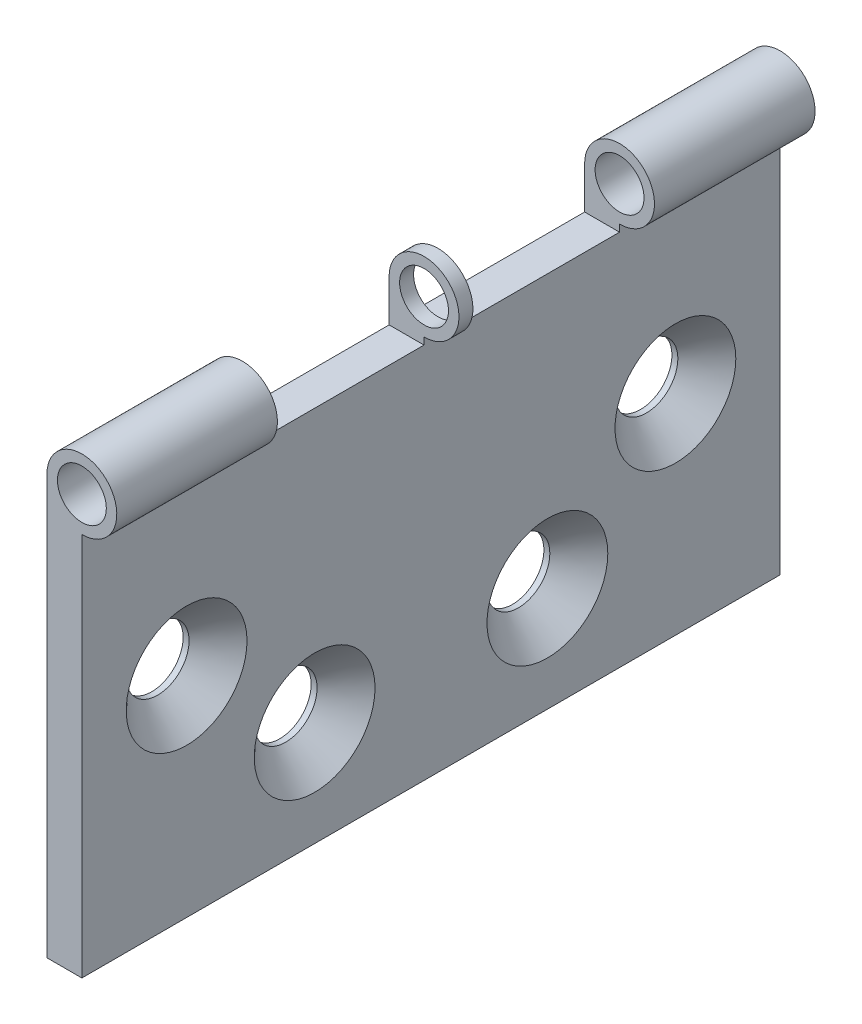
ISO-10303-21;
HEADER;
FILE_DESCRIPTION(('STEP AP214'),'2;1');
FILE_NAME('part.step','',(''),(''),'','','');
FILE_SCHEMA(('AUTOMOTIVE_DESIGN { 1 0 10303 214 1 1 1 1 }'));
ENDSEC;
DATA;
#1=APPLICATION_CONTEXT('core data for automotive mechanical design processes');
#2=APPLICATION_PROTOCOL_DEFINITION('international standard','automotive_design',2000,#1);
#3=PRODUCT_CONTEXT('',#1,'mechanical');
#4=PRODUCT('Part','Part','',(#3));
#5=PRODUCT_RELATED_PRODUCT_CATEGORY('part','',(#4));
#6=PRODUCT_DEFINITION_FORMATION('','',#4);
#7=PRODUCT_DEFINITION_CONTEXT('part definition',#1,'design');
#8=PRODUCT_DEFINITION('design','',#6,#7);
#9=PRODUCT_DEFINITION_SHAPE('','',#8);
#10=(LENGTH_UNIT() NAMED_UNIT(*) SI_UNIT(.MILLI.,.METRE.));
#11=(NAMED_UNIT(*) PLANE_ANGLE_UNIT() SI_UNIT($,.RADIAN.));
#12=(NAMED_UNIT(*) SI_UNIT($,.STERADIAN.) SOLID_ANGLE_UNIT());
#13=UNCERTAINTY_MEASURE_WITH_UNIT(LENGTH_MEASURE(1.E-05),#10,'distance_accuracy_value','');
#14=(GEOMETRIC_REPRESENTATION_CONTEXT(3) GLOBAL_UNCERTAINTY_ASSIGNED_CONTEXT((#13)) GLOBAL_UNIT_ASSIGNED_CONTEXT((#10,
#11,#12)) REPRESENTATION_CONTEXT('',''));
#15=CARTESIAN_POINT('',(0.,0.,0.));
#16=DIRECTION('',(0.,0.,1.));
#17=DIRECTION('',(1.,0.,0.));
#18=AXIS2_PLACEMENT_3D('',#15,#16,#17);
#19=CARTESIAN_POINT('',(5.,0.,50.));
#20=DIRECTION('',(-1.,0.,0.));
#21=DIRECTION('',(0.,0.,1.));
#22=AXIS2_PLACEMENT_3D('',#19,#20,#21);
#23=PLANE('',#22);
#24=CARTESIAN_POINT('',(5.,15.,-16.6666666666667));
#25=DIRECTION('',(1.,0.,0.));
#26=DIRECTION('',(0.,0.,-1.));
#27=AXIS2_PLACEMENT_3D('',#24,#25,#26);
#28=CIRCLE('',#27,8.65);
#29=CARTESIAN_POINT('',(5.,15.,-25.3166666666667));
#30=VERTEX_POINT('',#29);
#31=EDGE_CURVE('E336',#30,#30,#28,.T.);
#32=ORIENTED_EDGE('',*,*,#31,.F.);
#33=EDGE_LOOP('',(#32));
#34=FACE_BOUND('',#33,.T.);
#35=CARTESIAN_POINT('',(5.,30.,35.));
#36=DIRECTION('',(1.,0.,0.));
#37=DIRECTION('',(0.,0.,-1.));
#38=AXIS2_PLACEMENT_3D('',#35,#36,#37);
#39=CIRCLE('',#38,8.65);
#40=CARTESIAN_POINT('',(5.,30.,26.35));
#41=VERTEX_POINT('',#40);
#42=EDGE_CURVE('E348',#41,#41,#39,.T.);
#43=ORIENTED_EDGE('',*,*,#42,.F.);
#44=EDGE_LOOP('',(#43));
#45=FACE_BOUND('',#44,.T.);
#46=CARTESIAN_POINT('',(5.,15.,16.6666666666667));
#47=DIRECTION('',(1.,0.,0.));
#48=DIRECTION('',(0.,0.,-1.));
#49=AXIS2_PLACEMENT_3D('',#46,#47,#48);
#50=CIRCLE('',#49,8.65);
#51=CARTESIAN_POINT('',(5.,15.,8.01666666666667));
#52=VERTEX_POINT('',#51);
#53=EDGE_CURVE('E360',#52,#52,#50,.T.);
#54=ORIENTED_EDGE('',*,*,#53,.F.);
#55=EDGE_LOOP('',(#54));
#56=FACE_BOUND('',#55,.T.);
#57=CARTESIAN_POINT('',(5.,30.,-35.));
#58=DIRECTION('',(1.,0.,0.));
#59=DIRECTION('',(0.,0.,-1.));
#60=AXIS2_PLACEMENT_3D('',#57,#58,#59);
#61=CIRCLE('',#60,8.65);
#62=CARTESIAN_POINT('',(5.,30.,-43.65));
#63=VERTEX_POINT('',#62);
#64=EDGE_CURVE('E324',#63,#63,#61,.T.);
#65=ORIENTED_EDGE('',*,*,#64,.F.);
#66=EDGE_LOOP('',(#65));
#67=FACE_BOUND('',#66,.T.);
#68=DIRECTION('',(0.,1.,0.));
#69=VECTOR('',#68,1.);
#70=CARTESIAN_POINT('',(5.,0.,-27.));
#71=LINE('',#70,#69);
#72=CARTESIAN_POINT('',(5.,54.,-27.));
#73=VERTEX_POINT('',#72);
#74=CARTESIAN_POINT('',(5.,55.,-27.));
#75=VERTEX_POINT('',#74);
#76=EDGE_CURVE('E316',#73,#75,#71,.T.);
#77=ORIENTED_EDGE('',*,*,#76,.F.);
#78=DIRECTION('',(0.,0.,1.));
#79=VECTOR('',#78,1.);
#80=CARTESIAN_POINT('',(5.,54.,50.));
#81=LINE('',#80,#79);
#82=CARTESIAN_POINT('',(5.,54.,-0.999999999999987));
#83=VERTEX_POINT('',#82);
#84=EDGE_CURVE('E259',#73,#83,#81,.T.);
#85=ORIENTED_EDGE('',*,*,#84,.T.);
#86=DIRECTION('',(0.,1.,0.));
#87=VECTOR('',#86,1.);
#88=CARTESIAN_POINT('',(5.,0.,-0.999999999999987));
#89=LINE('',#88,#87);
#90=CARTESIAN_POINT('',(5.,55.,-0.999999999999987));
#91=VERTEX_POINT('',#90);
#92=EDGE_CURVE('E309',#83,#91,#89,.T.);
#93=ORIENTED_EDGE('',*,*,#92,.T.);
#94=DIRECTION('',(0.,0.,-1.));
#95=VECTOR('',#94,1.);
#96=CARTESIAN_POINT('',(5.,55.,50.));
#97=LINE('',#96,#95);
#98=CARTESIAN_POINT('',(5.,55.,0.999999999999987));
#99=VERTEX_POINT('',#98);
#100=EDGE_CURVE('E392',#99,#91,#97,.T.);
#101=ORIENTED_EDGE('',*,*,#100,.F.);
#102=DIRECTION('',(0.,1.,0.));
#103=VECTOR('',#102,1.);
#104=CARTESIAN_POINT('',(5.,0.,0.999999999999987));
#105=LINE('',#104,#103);
#106=CARTESIAN_POINT('',(5.,54.,0.999999999999987));
#107=VERTEX_POINT('',#106);
#108=EDGE_CURVE('E302',#107,#99,#105,.T.);
#109=ORIENTED_EDGE('',*,*,#108,.F.);
#110=DIRECTION('',(0.,0.,1.));
#111=VECTOR('',#110,1.);
#112=CARTESIAN_POINT('',(5.,54.,50.));
#113=LINE('',#112,#111);
#114=CARTESIAN_POINT('',(5.,54.,27.));
#115=VERTEX_POINT('',#114);
#116=EDGE_CURVE('E315',#107,#115,#113,.T.);
#117=ORIENTED_EDGE('',*,*,#116,.T.);
#118=DIRECTION('',(0.,1.,0.));
#119=VECTOR('',#118,1.);
#120=CARTESIAN_POINT('',(5.,0.,27.));
#121=LINE('',#120,#119);
#122=CARTESIAN_POINT('',(5.,55.,27.));
#123=VERTEX_POINT('',#122);
#124=EDGE_CURVE('E294',#115,#123,#121,.T.);
#125=ORIENTED_EDGE('',*,*,#124,.T.);
#126=CARTESIAN_POINT('',(5.,55.,50.));
#127=VERTEX_POINT('',#126);
#128=EDGE_CURVE('E157',#127,#123,#97,.T.);
#129=ORIENTED_EDGE('',*,*,#128,.F.);
#130=DIRECTION('',(0.,1.,0.));
#131=VECTOR('',#130,1.);
#132=CARTESIAN_POINT('',(5.,0.,50.));
#133=LINE('',#132,#131);
#134=CARTESIAN_POINT('',(5.,0.,50.));
#135=VERTEX_POINT('',#134);
#136=EDGE_CURVE('E393',#135,#127,#133,.T.);
#137=ORIENTED_EDGE('',*,*,#136,.F.);
#138=DIRECTION('',(0.,0.,-1.));
#139=VECTOR('',#138,1.);
#140=CARTESIAN_POINT('',(5.,0.,50.));
#141=LINE('',#140,#139);
#142=CARTESIAN_POINT('',(5.,0.,-50.));
#143=VERTEX_POINT('',#142);
#144=EDGE_CURVE('E166',#135,#143,#141,.T.);
#145=ORIENTED_EDGE('',*,*,#144,.T.);
#146=DIRECTION('',(0.,1.,0.));
#147=VECTOR('',#146,1.);
#148=CARTESIAN_POINT('',(5.,0.,-50.));
#149=LINE('',#148,#147);
#150=CARTESIAN_POINT('',(5.,55.,-50.));
#151=VERTEX_POINT('',#150);
#152=EDGE_CURVE('E391',#143,#151,#149,.T.);
#153=ORIENTED_EDGE('',*,*,#152,.T.);
#154=EDGE_CURVE('E388',#75,#151,#97,.T.);
#155=ORIENTED_EDGE('',*,*,#154,.F.);
#156=EDGE_LOOP('',(#77,#85,#93,#101,#109,#117,#125,#129,#137,#145,#153,#155));
#157=FACE_BOUND('',#156,.T.);
#158=ADVANCED_FACE('F139',(#34,#45,#56,#67,#157),#23,.F.);
#159=CARTESIAN_POINT('',(0.,0.,50.));
#160=DIRECTION('',(-1.,0.,0.));
#161=DIRECTION('',(0.,0.,1.));
#162=AXIS2_PLACEMENT_3D('',#159,#160,#161);
#163=PLANE('',#162);
#164=CARTESIAN_POINT('',(0.,30.,-35.));
#165=DIRECTION('',(1.,0.,0.));
#166=DIRECTION('',(0.,0.,-1.));
#167=AXIS2_PLACEMENT_3D('',#164,#165,#166);
#168=CIRCLE('',#167,4.5);
#169=CARTESIAN_POINT('',(0.,30.,-39.5));
#170=VERTEX_POINT('',#169);
#171=EDGE_CURVE('E332',#170,#170,#168,.T.);
#172=ORIENTED_EDGE('',*,*,#171,.T.);
#173=EDGE_LOOP('',(#172));
#174=FACE_BOUND('',#173,.T.);
#175=CARTESIAN_POINT('',(0.,15.,-16.6666666666667));
#176=DIRECTION('',(1.,0.,0.));
#177=DIRECTION('',(0.,0.,-1.));
#178=AXIS2_PLACEMENT_3D('',#175,#176,#177);
#179=CIRCLE('',#178,4.5);
#180=CARTESIAN_POINT('',(0.,15.,-21.1666666666667));
#181=VERTEX_POINT('',#180);
#182=EDGE_CURVE('E344',#181,#181,#179,.T.);
#183=ORIENTED_EDGE('',*,*,#182,.T.);
#184=EDGE_LOOP('',(#183));
#185=FACE_BOUND('',#184,.T.);
#186=CARTESIAN_POINT('',(0.,30.,35.));
#187=DIRECTION('',(1.,0.,0.));
#188=DIRECTION('',(0.,0.,-1.));
#189=AXIS2_PLACEMENT_3D('',#186,#187,#188);
#190=CIRCLE('',#189,4.5);
#191=CARTESIAN_POINT('',(0.,30.,30.5));
#192=VERTEX_POINT('',#191);
#193=EDGE_CURVE('E356',#192,#192,#190,.T.);
#194=ORIENTED_EDGE('',*,*,#193,.T.);
#195=EDGE_LOOP('',(#194));
#196=FACE_BOUND('',#195,.T.);
#197=CARTESIAN_POINT('',(0.,15.,16.6666666666667));
#198=DIRECTION('',(1.,0.,0.));
#199=DIRECTION('',(0.,0.,-1.));
#200=AXIS2_PLACEMENT_3D('',#197,#198,#199);
#201=CIRCLE('',#200,4.5);
#202=CARTESIAN_POINT('',(0.,15.,12.1666666666667));
#203=VERTEX_POINT('',#202);
#204=EDGE_CURVE('E368',#203,#203,#201,.T.);
#205=ORIENTED_EDGE('',*,*,#204,.T.);
#206=EDGE_LOOP('',(#205));
#207=FACE_BOUND('',#206,.T.);
#208=DIRECTION('',(0.,0.,-1.));
#209=VECTOR('',#208,1.);
#210=CARTESIAN_POINT('',(0.,54.,-0.999999999999987));
#211=LINE('',#210,#209);
#212=CARTESIAN_POINT('',(0.,54.,-0.999999999999987));
#213=VERTEX_POINT('',#212);
#214=CARTESIAN_POINT('',(0.,54.,-27.));
#215=VERTEX_POINT('',#214);
#216=EDGE_CURVE('E256',#213,#215,#211,.T.);
#217=ORIENTED_EDGE('',*,*,#216,.T.);
#218=DIRECTION('',(0.,-1.,0.));
#219=VECTOR('',#218,1.);
#220=CARTESIAN_POINT('',(0.,0.,-27.));
#221=LINE('',#220,#219);
#222=CARTESIAN_POINT('',(0.,60.,-27.));
#223=VERTEX_POINT('',#222);
#224=EDGE_CURVE('E239',#223,#215,#221,.T.);
#225=ORIENTED_EDGE('',*,*,#224,.F.);
#226=DIRECTION('',(0.,0.,-1.));
#227=VECTOR('',#226,1.);
#228=CARTESIAN_POINT('',(0.,60.,50.));
#229=LINE('',#228,#227);
#230=CARTESIAN_POINT('',(0.,60.,-50.));
#231=VERTEX_POINT('',#230);
#232=EDGE_CURVE('E150',#223,#231,#229,.T.);
#233=ORIENTED_EDGE('',*,*,#232,.T.);
#234=DIRECTION('',(0.,1.,0.));
#235=VECTOR('',#234,1.);
#236=CARTESIAN_POINT('',(0.,0.,-50.));
#237=LINE('',#236,#235);
#238=CARTESIAN_POINT('',(0.,0.,-50.));
#239=VERTEX_POINT('',#238);
#240=EDGE_CURVE('E404',#239,#231,#237,.T.);
#241=ORIENTED_EDGE('',*,*,#240,.F.);
#242=DIRECTION('',(0.,0.,-1.));
#243=VECTOR('',#242,1.);
#244=CARTESIAN_POINT('',(0.,0.,50.));
#245=LINE('',#244,#243);
#246=CARTESIAN_POINT('',(0.,0.,50.));
#247=VERTEX_POINT('',#246);
#248=EDGE_CURVE('E413',#247,#239,#245,.T.);
#249=ORIENTED_EDGE('',*,*,#248,.F.);
#250=DIRECTION('',(0.,1.,0.));
#251=VECTOR('',#250,1.);
#252=CARTESIAN_POINT('',(0.,0.,50.));
#253=LINE('',#252,#251);
#254=CARTESIAN_POINT('',(0.,60.,50.));
#255=VERTEX_POINT('',#254);
#256=EDGE_CURVE('E184',#247,#255,#253,.T.);
#257=ORIENTED_EDGE('',*,*,#256,.T.);
#258=CARTESIAN_POINT('',(0.,60.,27.));
#259=VERTEX_POINT('',#258);
#260=EDGE_CURVE('E12',#255,#259,#229,.T.);
#261=ORIENTED_EDGE('',*,*,#260,.T.);
#262=DIRECTION('',(0.,-1.,0.));
#263=VECTOR('',#262,1.);
#264=CARTESIAN_POINT('',(0.,65.,27.));
#265=LINE('',#264,#263);
#266=CARTESIAN_POINT('',(0.,54.,27.));
#267=VERTEX_POINT('',#266);
#268=EDGE_CURVE('E284',#259,#267,#265,.T.);
#269=ORIENTED_EDGE('',*,*,#268,.T.);
#270=DIRECTION('',(0.,0.,-1.));
#271=VECTOR('',#270,1.);
#272=CARTESIAN_POINT('',(0.,54.,27.));
#273=LINE('',#272,#271);
#274=CARTESIAN_POINT('',(0.,54.,0.999999999999987));
#275=VERTEX_POINT('',#274);
#276=EDGE_CURVE('E272',#267,#275,#273,.T.);
#277=ORIENTED_EDGE('',*,*,#276,.T.);
#278=DIRECTION('',(0.,-1.,0.));
#279=VECTOR('',#278,1.);
#280=CARTESIAN_POINT('',(0.,65.,0.999999999999987));
#281=LINE('',#280,#279);
#282=CARTESIAN_POINT('',(0.,60.,0.999999999999987));
#283=VERTEX_POINT('',#282);
#284=EDGE_CURVE('E267',#283,#275,#281,.T.);
#285=ORIENTED_EDGE('',*,*,#284,.F.);
#286=CARTESIAN_POINT('',(0.,60.,-0.999999999999987));
#287=VERTEX_POINT('',#286);
#288=EDGE_CURVE('E148',#283,#287,#229,.T.);
#289=ORIENTED_EDGE('',*,*,#288,.T.);
#290=DIRECTION('',(0.,-1.,0.));
#291=VECTOR('',#290,1.);
#292=CARTESIAN_POINT('',(0.,0.,-0.999999999999987));
#293=LINE('',#292,#291);
#294=EDGE_CURVE('E250',#287,#213,#293,.T.);
#295=ORIENTED_EDGE('',*,*,#294,.T.);
#296=EDGE_LOOP('',(#217,#225,#233,#241,#249,#257,#261,#269,#277,#285,#289,#295));
#297=FACE_BOUND('',#296,.T.);
#298=ADVANCED_FACE('F263',(#174,#185,#196,#207,#297),#163,.T.);
#299=CARTESIAN_POINT('',(5.,60.,50.));
#300=DIRECTION('',(0.,0.,-1.));
#301=DIRECTION('',(-1.,0.,0.));
#302=AXIS2_PLACEMENT_3D('',#299,#300,#301);
#303=CYLINDRICAL_SURFACE('',#302,5.);
#304=CARTESIAN_POINT('',(5.,60.,-27.));
#305=DIRECTION('',(0.,0.,1.));
#306=DIRECTION('',(1.,0.,0.));
#307=AXIS2_PLACEMENT_3D('',#304,#305,#306);
#308=CIRCLE('',#307,5.);
#309=EDGE_CURVE('E245',#75,#223,#308,.T.);
#310=ORIENTED_EDGE('',*,*,#309,.F.);
#311=ORIENTED_EDGE('',*,*,#154,.T.);
#312=CARTESIAN_POINT('',(5.,60.,-50.));
#313=DIRECTION('',(0.,0.,1.));
#314=DIRECTION('',(1.,0.,0.));
#315=AXIS2_PLACEMENT_3D('',#312,#313,#314);
#316=CIRCLE('',#315,5.);
#317=EDGE_CURVE('E384',#151,#231,#316,.T.);
#318=ORIENTED_EDGE('',*,*,#317,.T.);
#319=ORIENTED_EDGE('',*,*,#232,.F.);
#320=EDGE_LOOP('',(#310,#311,#318,#319));
#321=FACE_BOUND('',#320,.T.);
#322=ADVANCED_FACE('F442',(#321),#303,.T.);
#323=ORIENTED_EDGE('',*,*,#100,.T.);
#324=CARTESIAN_POINT('',(5.,60.,-0.999999999999987));
#325=DIRECTION('',(0.,0.,1.));
#326=DIRECTION('',(1.,0.,0.));
#327=AXIS2_PLACEMENT_3D('',#324,#325,#326);
#328=CIRCLE('',#327,5.);
#329=EDGE_CURVE('E306',#91,#287,#328,.T.);
#330=ORIENTED_EDGE('',*,*,#329,.T.);
#331=ORIENTED_EDGE('',*,*,#288,.F.);
#332=CARTESIAN_POINT('',(5.,60.,0.999999999999987));
#333=DIRECTION('',(0.,0.,1.));
#334=DIRECTION('',(1.,0.,0.));
#335=AXIS2_PLACEMENT_3D('',#332,#333,#334);
#336=CIRCLE('',#335,5.);
#337=EDGE_CURVE('E298',#99,#283,#336,.T.);
#338=ORIENTED_EDGE('',*,*,#337,.F.);
#339=EDGE_LOOP('',(#323,#330,#331,#338));
#340=FACE_BOUND('',#339,.T.);
#341=ADVANCED_FACE('F437',(#340),#303,.T.);
#342=ORIENTED_EDGE('',*,*,#128,.T.);
#343=CARTESIAN_POINT('',(5.,60.,27.));
#344=DIRECTION('',(0.,0.,1.));
#345=DIRECTION('',(1.,0.,0.));
#346=AXIS2_PLACEMENT_3D('',#343,#344,#345);
#347=CIRCLE('',#346,5.);
#348=EDGE_CURVE('E291',#123,#259,#347,.T.);
#349=ORIENTED_EDGE('',*,*,#348,.T.);
#350=ORIENTED_EDGE('',*,*,#260,.F.);
#351=CARTESIAN_POINT('',(5.,60.,50.));
#352=DIRECTION('',(0.,0.,1.));
#353=DIRECTION('',(1.,0.,0.));
#354=AXIS2_PLACEMENT_3D('',#351,#352,#353);
#355=CIRCLE('',#354,5.);
#356=EDGE_CURVE('E377',#127,#255,#355,.T.);
#357=ORIENTED_EDGE('',*,*,#356,.F.);
#358=EDGE_LOOP('',(#342,#349,#350,#357));
#359=FACE_BOUND('',#358,.T.);
#360=ADVANCED_FACE('F459',(#359),#303,.T.);
#361=CARTESIAN_POINT('',(5.,60.,-50.));
#362=DIRECTION('',(0.,0.,1.));
#363=DIRECTION('',(1.,0.,0.));
#364=AXIS2_PLACEMENT_3D('',#361,#362,#363);
#365=CYLINDRICAL_SURFACE('',#364,3.5);
#366=CARTESIAN_POINT('',(5.,60.,-50.));
#367=DIRECTION('',(0.,0.,1.));
#368=DIRECTION('',(1.,0.,0.));
#369=AXIS2_PLACEMENT_3D('',#366,#367,#368);
#370=CIRCLE('',#369,3.5);
#371=CARTESIAN_POINT('',(8.5,60.,-50.));
#372=VERTEX_POINT('',#371);
#373=EDGE_CURVE('E373',#372,#372,#370,.T.);
#374=ORIENTED_EDGE('',*,*,#373,.F.);
#375=EDGE_LOOP('',(#374));
#376=FACE_BOUND('',#375,.T.);
#377=CARTESIAN_POINT('',(5.,60.,-27.));
#378=DIRECTION('',(0.,0.,1.));
#379=DIRECTION('',(1.,0.,0.));
#380=AXIS2_PLACEMENT_3D('',#377,#378,#379);
#381=CIRCLE('',#380,3.5);
#382=CARTESIAN_POINT('',(8.5,60.,-27.));
#383=VERTEX_POINT('',#382);
#384=EDGE_CURVE('E142',#383,#383,#381,.F.);
#385=ORIENTED_EDGE('',*,*,#384,.F.);
#386=EDGE_LOOP('',(#385));
#387=FACE_BOUND('',#386,.T.);
#388=ADVANCED_FACE('F466',(#376,#387),#365,.F.);
#389=CARTESIAN_POINT('',(5.,0.,50.));
#390=DIRECTION('',(0.,-1.,0.));
#391=DIRECTION('',(0.,0.,-1.));
#392=AXIS2_PLACEMENT_3D('',#389,#390,#391);
#393=PLANE('',#392);
#394=DIRECTION('',(-1.,0.,0.));
#395=VECTOR('',#394,1.);
#396=CARTESIAN_POINT('',(5.,0.,-50.));
#397=LINE('',#396,#395);
#398=EDGE_CURVE('E396',#143,#239,#397,.T.);
#399=ORIENTED_EDGE('',*,*,#398,.F.);
#400=ORIENTED_EDGE('',*,*,#144,.F.);
#401=DIRECTION('',(-1.,0.,0.));
#402=VECTOR('',#401,1.);
#403=CARTESIAN_POINT('',(5.,0.,50.));
#404=LINE('',#403,#402);
#405=EDGE_CURVE('E399',#135,#247,#404,.T.);
#406=ORIENTED_EDGE('',*,*,#405,.T.);
#407=ORIENTED_EDGE('',*,*,#248,.T.);
#408=EDGE_LOOP('',(#399,#400,#406,#407));
#409=FACE_BOUND('',#408,.T.);
#410=ADVANCED_FACE('F464',(#409),#393,.T.);
#411=CARTESIAN_POINT('',(0.,0.,50.));
#412=DIRECTION('',(0.,0.,-1.));
#413=DIRECTION('',(-1.,0.,0.));
#414=AXIS2_PLACEMENT_3D('',#411,#412,#413);
#415=PLANE('',#414);
#416=CARTESIAN_POINT('',(5.,60.,50.));
#417=DIRECTION('',(0.,0.,1.));
#418=DIRECTION('',(1.,0.,0.));
#419=AXIS2_PLACEMENT_3D('',#416,#417,#418);
#420=CIRCLE('',#419,3.5);
#421=CARTESIAN_POINT('',(8.5,60.,50.));
#422=VERTEX_POINT('',#421);
#423=EDGE_CURVE('E372',#422,#422,#420,.T.);
#424=ORIENTED_EDGE('',*,*,#423,.F.);
#425=EDGE_LOOP('',(#424));
#426=FACE_BOUND('',#425,.T.);
#427=ORIENTED_EDGE('',*,*,#136,.T.);
#428=ORIENTED_EDGE('',*,*,#356,.T.);
#429=ORIENTED_EDGE('',*,*,#256,.F.);
#430=ORIENTED_EDGE('',*,*,#405,.F.);
#431=EDGE_LOOP('',(#427,#428,#429,#430));
#432=FACE_BOUND('',#431,.T.);
#433=ADVANCED_FACE('F462',(#426,#432),#415,.F.);
#434=CARTESIAN_POINT('',(0.,0.,-50.));
#435=DIRECTION('',(0.,0.,-1.));
#436=DIRECTION('',(-1.,0.,0.));
#437=AXIS2_PLACEMENT_3D('',#434,#435,#436);
#438=PLANE('',#437);
#439=ORIENTED_EDGE('',*,*,#373,.T.);
#440=EDGE_LOOP('',(#439));
#441=FACE_BOUND('',#440,.T.);
#442=ORIENTED_EDGE('',*,*,#240,.T.);
#443=ORIENTED_EDGE('',*,*,#317,.F.);
#444=ORIENTED_EDGE('',*,*,#152,.F.);
#445=ORIENTED_EDGE('',*,*,#398,.T.);
#446=EDGE_LOOP('',(#442,#443,#444,#445));
#447=FACE_BOUND('',#446,.T.);
#448=ADVANCED_FACE('F445',(#441,#447),#438,.T.);
#449=CARTESIAN_POINT('',(5.,60.,27.));
#450=DIRECTION('',(0.,0.,1.));
#451=DIRECTION('',(1.,0.,0.));
#452=AXIS2_PLACEMENT_3D('',#449,#450,#451);
#453=CIRCLE('',#452,3.5);
#454=CARTESIAN_POINT('',(8.5,60.,27.));
#455=VERTEX_POINT('',#454);
#456=EDGE_CURVE('E249',#455,#455,#453,.F.);
#457=ORIENTED_EDGE('',*,*,#456,.T.);
#458=EDGE_LOOP('',(#457));
#459=FACE_BOUND('',#458,.T.);
#460=ORIENTED_EDGE('',*,*,#423,.T.);
#461=EDGE_LOOP('',(#460));
#462=FACE_BOUND('',#461,.T.);
#463=ADVANCED_FACE('F476',(#459,#462),#365,.F.);
#464=CARTESIAN_POINT('',(5.,15.,16.6666666666667));
#465=DIRECTION('',(1.,0.,0.));
#466=DIRECTION('',(0.,0.,-1.));
#467=AXIS2_PLACEMENT_3D('',#464,#465,#466);
#468=CYLINDRICAL_SURFACE('',#467,4.5);
#469=ORIENTED_EDGE('',*,*,#204,.F.);
#470=EDGE_LOOP('',(#469));
#471=FACE_BOUND('',#470,.T.);
#472=CARTESIAN_POINT('',(0.850000000000001,15.,16.6666666666667));
#473=DIRECTION('',(1.,0.,0.));
#474=DIRECTION('',(0.,0.,-1.));
#475=AXIS2_PLACEMENT_3D('',#472,#473,#474);
#476=CIRCLE('',#475,4.5);
#477=CARTESIAN_POINT('',(0.850000000000001,15.,12.1666666666667));
#478=VERTEX_POINT('',#477);
#479=EDGE_CURVE('E364',#478,#478,#476,.T.);
#480=ORIENTED_EDGE('',*,*,#479,.T.);
#481=EDGE_LOOP('',(#480));
#482=FACE_BOUND('',#481,.T.);
#483=ADVANCED_FACE('F528',(#471,#482),#468,.F.);
#484=CARTESIAN_POINT('',(5.,15.,16.6666666666667));
#485=DIRECTION('',(1.,0.,0.));
#486=DIRECTION('',(0.,0.,-1.));
#487=AXIS2_PLACEMENT_3D('',#484,#485,#486);
#488=CONICAL_SURFACE('',#487,8.65,0.785398163397448);
#489=ORIENTED_EDGE('',*,*,#479,.F.);
#490=EDGE_LOOP('',(#489));
#491=FACE_BOUND('',#490,.T.);
#492=ORIENTED_EDGE('',*,*,#53,.T.);
#493=EDGE_LOOP('',(#492));
#494=FACE_BOUND('',#493,.T.);
#495=ADVANCED_FACE('F524',(#491,#494),#488,.F.);
#496=CARTESIAN_POINT('',(5.,30.,35.));
#497=DIRECTION('',(1.,0.,0.));
#498=DIRECTION('',(0.,0.,-1.));
#499=AXIS2_PLACEMENT_3D('',#496,#497,#498);
#500=CYLINDRICAL_SURFACE('',#499,4.5);
#501=ORIENTED_EDGE('',*,*,#193,.F.);
#502=EDGE_LOOP('',(#501));
#503=FACE_BOUND('',#502,.T.);
#504=CARTESIAN_POINT('',(0.850000000000001,30.,35.));
#505=DIRECTION('',(1.,0.,0.));
#506=DIRECTION('',(0.,0.,-1.));
#507=AXIS2_PLACEMENT_3D('',#504,#505,#506);
#508=CIRCLE('',#507,4.5);
#509=CARTESIAN_POINT('',(0.850000000000001,30.,30.5));
#510=VERTEX_POINT('',#509);
#511=EDGE_CURVE('E352',#510,#510,#508,.T.);
#512=ORIENTED_EDGE('',*,*,#511,.T.);
#513=EDGE_LOOP('',(#512));
#514=FACE_BOUND('',#513,.T.);
#515=ADVANCED_FACE('F520',(#503,#514),#500,.F.);
#516=CARTESIAN_POINT('',(5.,30.,35.));
#517=DIRECTION('',(1.,0.,0.));
#518=DIRECTION('',(0.,0.,-1.));
#519=AXIS2_PLACEMENT_3D('',#516,#517,#518);
#520=CONICAL_SURFACE('',#519,8.65,0.785398163397449);
#521=ORIENTED_EDGE('',*,*,#511,.F.);
#522=EDGE_LOOP('',(#521));
#523=FACE_BOUND('',#522,.T.);
#524=ORIENTED_EDGE('',*,*,#42,.T.);
#525=EDGE_LOOP('',(#524));
#526=FACE_BOUND('',#525,.T.);
#527=ADVANCED_FACE('F516',(#523,#526),#520,.F.);
#528=CARTESIAN_POINT('',(5.,15.,-16.6666666666667));
#529=DIRECTION('',(1.,0.,0.));
#530=DIRECTION('',(0.,0.,-1.));
#531=AXIS2_PLACEMENT_3D('',#528,#529,#530);
#532=CYLINDRICAL_SURFACE('',#531,4.5);
#533=ORIENTED_EDGE('',*,*,#182,.F.);
#534=EDGE_LOOP('',(#533));
#535=FACE_BOUND('',#534,.T.);
#536=CARTESIAN_POINT('',(0.850000000000001,15.,-16.6666666666667));
#537=DIRECTION('',(1.,0.,0.));
#538=DIRECTION('',(0.,0.,-1.));
#539=AXIS2_PLACEMENT_3D('',#536,#537,#538);
#540=CIRCLE('',#539,4.5);
#541=CARTESIAN_POINT('',(0.850000000000001,15.,-21.1666666666667));
#542=VERTEX_POINT('',#541);
#543=EDGE_CURVE('E340',#542,#542,#540,.T.);
#544=ORIENTED_EDGE('',*,*,#543,.T.);
#545=EDGE_LOOP('',(#544));
#546=FACE_BOUND('',#545,.T.);
#547=ADVANCED_FACE('F512',(#535,#546),#532,.F.);
#548=CARTESIAN_POINT('',(5.,15.,-16.6666666666667));
#549=DIRECTION('',(1.,0.,0.));
#550=DIRECTION('',(0.,0.,-1.));
#551=AXIS2_PLACEMENT_3D('',#548,#549,#550);
#552=CONICAL_SURFACE('',#551,8.65,0.785398163397448);
#553=ORIENTED_EDGE('',*,*,#543,.F.);
#554=EDGE_LOOP('',(#553));
#555=FACE_BOUND('',#554,.T.);
#556=ORIENTED_EDGE('',*,*,#31,.T.);
#557=EDGE_LOOP('',(#556));
#558=FACE_BOUND('',#557,.T.);
#559=ADVANCED_FACE('F502',(#555,#558),#552,.F.);
#560=CARTESIAN_POINT('',(5.,30.,-35.));
#561=DIRECTION('',(1.,0.,0.));
#562=DIRECTION('',(0.,0.,-1.));
#563=AXIS2_PLACEMENT_3D('',#560,#561,#562);
#564=CYLINDRICAL_SURFACE('',#563,4.5);
#565=ORIENTED_EDGE('',*,*,#171,.F.);
#566=EDGE_LOOP('',(#565));
#567=FACE_BOUND('',#566,.T.);
#568=CARTESIAN_POINT('',(0.850000000000001,30.,-35.));
#569=DIRECTION('',(1.,0.,0.));
#570=DIRECTION('',(0.,0.,-1.));
#571=AXIS2_PLACEMENT_3D('',#568,#569,#570);
#572=CIRCLE('',#571,4.5);
#573=CARTESIAN_POINT('',(0.850000000000001,30.,-39.5));
#574=VERTEX_POINT('',#573);
#575=EDGE_CURVE('E328',#574,#574,#572,.T.);
#576=ORIENTED_EDGE('',*,*,#575,.T.);
#577=EDGE_LOOP('',(#576));
#578=FACE_BOUND('',#577,.T.);
#579=ADVANCED_FACE('F494',(#567,#578),#564,.F.);
#580=CARTESIAN_POINT('',(5.,30.,-35.));
#581=DIRECTION('',(1.,0.,0.));
#582=DIRECTION('',(0.,0.,-1.));
#583=AXIS2_PLACEMENT_3D('',#580,#581,#582);
#584=CONICAL_SURFACE('',#583,8.65,0.785398163397449);
#585=ORIENTED_EDGE('',*,*,#575,.F.);
#586=EDGE_LOOP('',(#585));
#587=FACE_BOUND('',#586,.T.);
#588=ORIENTED_EDGE('',*,*,#64,.T.);
#589=EDGE_LOOP('',(#588));
#590=FACE_BOUND('',#589,.T.);
#591=ADVANCED_FACE('F492',(#587,#590),#584,.F.);
#592=CARTESIAN_POINT('',(0.,54.,27.));
#593=DIRECTION('',(0.,-1.,0.));
#594=DIRECTION('',(0.,0.,-1.));
#595=AXIS2_PLACEMENT_3D('',#592,#593,#594);
#596=PLANE('',#595);
#597=DIRECTION('',(1.,0.,0.));
#598=VECTOR('',#597,1.);
#599=CARTESIAN_POINT('',(0.,54.,0.999999999999987));
#600=LINE('',#599,#598);
#601=EDGE_CURVE('E276',#275,#107,#600,.T.);
#602=ORIENTED_EDGE('',*,*,#601,.F.);
#603=ORIENTED_EDGE('',*,*,#276,.F.);
#604=DIRECTION('',(1.,0.,0.));
#605=VECTOR('',#604,1.);
#606=CARTESIAN_POINT('',(0.,54.,27.));
#607=LINE('',#606,#605);
#608=EDGE_CURVE('E280',#267,#115,#607,.T.);
#609=ORIENTED_EDGE('',*,*,#608,.T.);
#610=ORIENTED_EDGE('',*,*,#116,.F.);
#611=EDGE_LOOP('',(#602,#603,#609,#610));
#612=FACE_BOUND('',#611,.T.);
#613=ADVANCED_FACE('F455',(#612),#596,.F.);
#614=CARTESIAN_POINT('',(0.,0.,0.999999999999987));
#615=DIRECTION('',(0.,0.,1.));
#616=DIRECTION('',(1.,0.,0.));
#617=AXIS2_PLACEMENT_3D('',#614,#615,#616);
#618=PLANE('',#617);
#619=CARTESIAN_POINT('',(5.,60.,0.999999999999987));
#620=DIRECTION('',(0.,0.,1.));
#621=DIRECTION('',(1.,0.,0.));
#622=AXIS2_PLACEMENT_3D('',#619,#620,#621);
#623=CIRCLE('',#622,3.5);
#624=CARTESIAN_POINT('',(8.5,60.,0.999999999999987));
#625=VERTEX_POINT('',#624);
#626=EDGE_CURVE('E297',#625,#625,#623,.F.);
#627=ORIENTED_EDGE('',*,*,#626,.T.);
#628=EDGE_LOOP('',(#627));
#629=FACE_BOUND('',#628,.T.);
#630=ORIENTED_EDGE('',*,*,#337,.T.);
#631=ORIENTED_EDGE('',*,*,#284,.T.);
#632=ORIENTED_EDGE('',*,*,#601,.T.);
#633=ORIENTED_EDGE('',*,*,#108,.T.);
#634=EDGE_LOOP('',(#630,#631,#632,#633));
#635=FACE_BOUND('',#634,.T.);
#636=ADVANCED_FACE('F453',(#629,#635),#618,.T.);
#637=CARTESIAN_POINT('',(0.,0.,27.));
#638=DIRECTION('',(0.,0.,1.));
#639=DIRECTION('',(1.,0.,0.));
#640=AXIS2_PLACEMENT_3D('',#637,#638,#639);
#641=PLANE('',#640);
#642=ORIENTED_EDGE('',*,*,#456,.F.);
#643=EDGE_LOOP('',(#642));
#644=FACE_BOUND('',#643,.T.);
#645=ORIENTED_EDGE('',*,*,#348,.F.);
#646=ORIENTED_EDGE('',*,*,#124,.F.);
#647=ORIENTED_EDGE('',*,*,#608,.F.);
#648=ORIENTED_EDGE('',*,*,#268,.F.);
#649=EDGE_LOOP('',(#645,#646,#647,#648));
#650=FACE_BOUND('',#649,.T.);
#651=ADVANCED_FACE('F507',(#644,#650),#641,.F.);
#652=CARTESIAN_POINT('',(5.,60.,-0.999999999999987));
#653=DIRECTION('',(0.,0.,1.));
#654=DIRECTION('',(1.,0.,0.));
#655=AXIS2_PLACEMENT_3D('',#652,#653,#654);
#656=CIRCLE('',#655,3.5);
#657=CARTESIAN_POINT('',(8.5,60.,-0.999999999999987));
#658=VERTEX_POINT('',#657);
#659=EDGE_CURVE('E301',#658,#658,#656,.F.);
#660=ORIENTED_EDGE('',*,*,#659,.T.);
#661=EDGE_LOOP('',(#660));
#662=FACE_BOUND('',#661,.T.);
#663=ORIENTED_EDGE('',*,*,#626,.F.);
#664=EDGE_LOOP('',(#663));
#665=FACE_BOUND('',#664,.T.);
#666=ADVANCED_FACE('F425',(#662,#665),#365,.F.);
#667=CARTESIAN_POINT('',(0.,54.,-0.999999999999987));
#668=DIRECTION('',(0.,-1.,0.));
#669=DIRECTION('',(0.,0.,-1.));
#670=AXIS2_PLACEMENT_3D('',#667,#668,#669);
#671=PLANE('',#670);
#672=DIRECTION('',(1.,0.,0.));
#673=VECTOR('',#672,1.);
#674=CARTESIAN_POINT('',(0.,54.,-27.));
#675=LINE('',#674,#673);
#676=EDGE_CURVE('E243',#215,#73,#675,.T.);
#677=ORIENTED_EDGE('',*,*,#676,.F.);
#678=ORIENTED_EDGE('',*,*,#216,.F.);
#679=DIRECTION('',(1.,0.,0.));
#680=VECTOR('',#679,1.);
#681=CARTESIAN_POINT('',(0.,54.,-0.999999999999987));
#682=LINE('',#681,#680);
#683=EDGE_CURVE('E261',#213,#83,#682,.T.);
#684=ORIENTED_EDGE('',*,*,#683,.T.);
#685=ORIENTED_EDGE('',*,*,#84,.F.);
#686=EDGE_LOOP('',(#677,#678,#684,#685));
#687=FACE_BOUND('',#686,.T.);
#688=ADVANCED_FACE('F254',(#687),#671,.F.);
#689=CARTESIAN_POINT('',(0.,0.,-27.));
#690=DIRECTION('',(0.,0.,1.));
#691=DIRECTION('',(1.,0.,0.));
#692=AXIS2_PLACEMENT_3D('',#689,#690,#691);
#693=PLANE('',#692);
#694=ORIENTED_EDGE('',*,*,#384,.T.);
#695=EDGE_LOOP('',(#694));
#696=FACE_BOUND('',#695,.T.);
#697=ORIENTED_EDGE('',*,*,#309,.T.);
#698=ORIENTED_EDGE('',*,*,#224,.T.);
#699=ORIENTED_EDGE('',*,*,#676,.T.);
#700=ORIENTED_EDGE('',*,*,#76,.T.);
#701=EDGE_LOOP('',(#697,#698,#699,#700));
#702=FACE_BOUND('',#701,.T.);
#703=ADVANCED_FACE('F241',(#696,#702),#693,.T.);
#704=CARTESIAN_POINT('',(0.,0.,-0.999999999999987));
#705=DIRECTION('',(0.,0.,1.));
#706=DIRECTION('',(1.,0.,0.));
#707=AXIS2_PLACEMENT_3D('',#704,#705,#706);
#708=PLANE('',#707);
#709=ORIENTED_EDGE('',*,*,#659,.F.);
#710=EDGE_LOOP('',(#709));
#711=FACE_BOUND('',#710,.T.);
#712=ORIENTED_EDGE('',*,*,#329,.F.);
#713=ORIENTED_EDGE('',*,*,#92,.F.);
#714=ORIENTED_EDGE('',*,*,#683,.F.);
#715=ORIENTED_EDGE('',*,*,#294,.F.);
#716=EDGE_LOOP('',(#712,#713,#714,#715));
#717=FACE_BOUND('',#716,.T.);
#718=ADVANCED_FACE('F428',(#711,#717),#708,.F.);
#719=CLOSED_SHELL('',(#158,#298,#322,#341,#360,#388,#410,#433,#448,#463,#483,#495,#515,#527,
#547,#559,#579,#591,#613,#636,#651,#666,#688,#703,#718));
#720=MANIFOLD_SOLID_BREP('B2',#719);
#721=ADVANCED_BREP_SHAPE_REPRESENTATION('',(#18,#720),#14);
#722=SHAPE_DEFINITION_REPRESENTATION(#9,#721);
ENDSEC;
END-ISO-10303-21;
